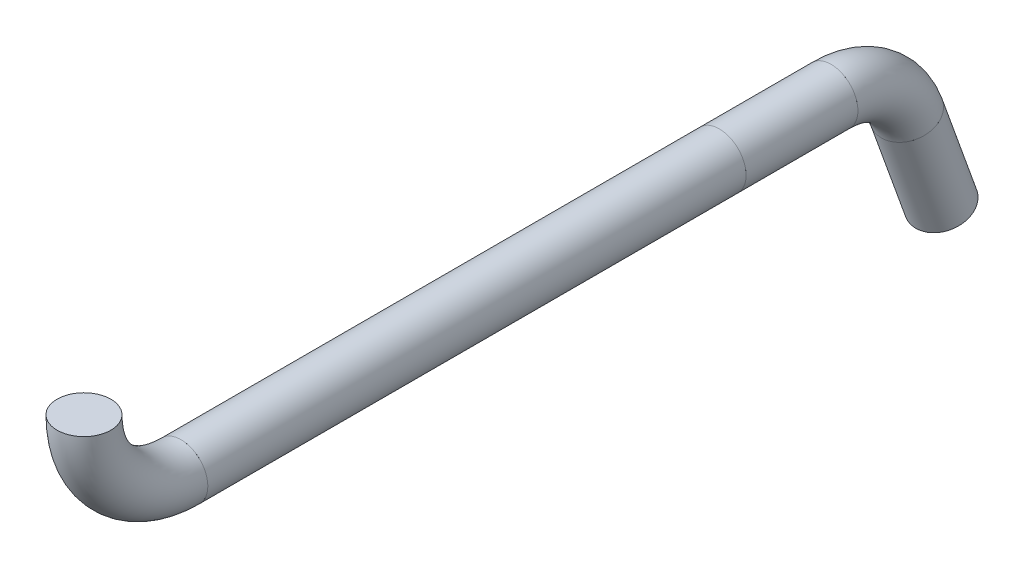
ISO-10303-21;
HEADER;
FILE_DESCRIPTION(('STEP AP214'),'2;1');
FILE_NAME('part.step','',(''),(''),'','','');
FILE_SCHEMA(('AUTOMOTIVE_DESIGN { 1 0 10303 214 1 1 1 1 }'));
ENDSEC;
DATA;
#1=APPLICATION_CONTEXT('core data for automotive mechanical design processes');
#2=APPLICATION_PROTOCOL_DEFINITION('international standard','automotive_design',2000,#1);
#3=PRODUCT_CONTEXT('',#1,'mechanical');
#4=PRODUCT('Part','Part','',(#3));
#5=PRODUCT_RELATED_PRODUCT_CATEGORY('part','',(#4));
#6=PRODUCT_DEFINITION_FORMATION('','',#4);
#7=PRODUCT_DEFINITION_CONTEXT('part definition',#1,'design');
#8=PRODUCT_DEFINITION('design','',#6,#7);
#9=PRODUCT_DEFINITION_SHAPE('','',#8);
#10=(LENGTH_UNIT() NAMED_UNIT(*) SI_UNIT(.MILLI.,.METRE.));
#11=(NAMED_UNIT(*) PLANE_ANGLE_UNIT() SI_UNIT($,.RADIAN.));
#12=(NAMED_UNIT(*) SI_UNIT($,.STERADIAN.) SOLID_ANGLE_UNIT());
#13=UNCERTAINTY_MEASURE_WITH_UNIT(LENGTH_MEASURE(1.E-05),#10,'distance_accuracy_value','');
#14=(GEOMETRIC_REPRESENTATION_CONTEXT(3) GLOBAL_UNCERTAINTY_ASSIGNED_CONTEXT((#13)) GLOBAL_UNIT_ASSIGNED_CONTEXT((#10,
#11,#12)) REPRESENTATION_CONTEXT('',''));
#15=CARTESIAN_POINT('',(0.,0.,0.));
#16=DIRECTION('',(0.,0.,1.));
#17=DIRECTION('',(1.,0.,0.));
#18=AXIS2_PLACEMENT_3D('',#15,#16,#17);
#19=CARTESIAN_POINT('',(-1.04762439148012,-187.845617875005,-220.220231443653));
#20=DIRECTION('',(-0.0052307758193522,-0.939678304412021,-0.342019477810368));
#21=DIRECTION('',(0.,0.342024156906533,-0.939691159952234));
#22=AXIS2_PLACEMENT_3D('',#19,#20,#21);
#23=CYLINDRICAL_SURFACE('',#22,49.9);
#24=CARTESIAN_POINT('',(-1.54388367359085,-276.99569749365,-252.668638025735));
#25=DIRECTION('',(0.00523077581934009,0.939678304411721,0.342019477811193));
#26=DIRECTION('',(0.,-0.342024156907358,0.939691159951934));
#27=AXIS2_PLACEMENT_3D('',#24,#25,#26);
#28=CIRCLE('',#27,49.9);
#29=CARTESIAN_POINT('',(-1.54388367359085,-294.062702923328,-205.778049144133));
#30=VERTEX_POINT('',#29);
#31=EDGE_CURVE('E60',#30,#30,#28,.F.);
#32=ORIENTED_EDGE('',*,*,#31,.F.);
#33=EDGE_LOOP('',(#32));
#34=FACE_BOUND('',#33,.T.);
#35=CARTESIAN_POINT('',(-0.551365109369398,-98.6955382563591,-187.771824861572));
#36=DIRECTION('',(-0.00523077581933964,-0.939678304411721,-0.342019477811193));
#37=DIRECTION('',(0.,0.342024156907358,-0.939691159951934));
#38=AXIS2_PLACEMENT_3D('',#35,#36,#37);
#39=CIRCLE('',#38,49.9);
#40=CARTESIAN_POINT('',(-0.551365109369398,-81.6285328266819,-234.662413743174));
#41=VERTEX_POINT('',#40);
#42=EDGE_CURVE('E12',#41,#41,#39,.T.);
#43=ORIENTED_EDGE('',*,*,#42,.T.);
#44=EDGE_LOOP('',(#43));
#45=FACE_BOUND('',#44,.T.);
#46=ADVANCED_FACE('F57',(#34,#45),#23,.T.);
#47=CARTESIAN_POINT('',(-1.81357545905958,-325.798231686941,-118.582434595143));
#48=DIRECTION('',(0.00523077581934009,0.939678304411721,0.342019477811193));
#49=DIRECTION('',(0.,-0.342024156907358,0.939691159951934));
#50=AXIS2_PLACEMENT_3D('',#47,#48,#49);
#51=PLANE('',#50);
#52=ORIENTED_EDGE('',*,*,#31,.T.);
#53=EDGE_LOOP('',(#52));
#54=FACE_BOUND('',#53,.T.);
#55=ADVANCED_FACE('F76',(#54),#51,.F.);
#56=CARTESIAN_POINT('',(-0.821056894840349,-147.498072449707,-53.6856214308239));
#57=DIRECTION('',(-0.00523077581933964,-0.939678304411721,-0.342019477811193));
#58=DIRECTION('',(0.,0.342024156907358,-0.939691159951934));
#59=AXIS2_PLACEMENT_3D('',#56,#57,#58);
#60=PLANE('',#59);
#61=ORIENTED_EDGE('',*,*,#42,.F.);
#62=EDGE_LOOP('',(#61));
#63=FACE_BOUND('',#62,.T.);
#64=ADVANCED_FACE('F82',(#63),#60,.F.);
#65=CLOSED_SHELL('',(#46,#55,#64));
#66=MANIFOLD_SOLID_BREP('B2',#65);
#67=CARTESIAN_POINT('',(-0.835935154537799,-149.997670695678,-46.8178954127342));
#68=DIRECTION('',(0.999984519814332,-0.00556417936035084,-6.3043754299794E-06));
#69=DIRECTION('',(0.00189713363445594,0.342014216262124,-0.939692862992254));
#70=AXIS2_PLACEMENT_3D('',#67,#68,#69);
#71=TOROIDAL_SURFACE('',#70,150.,49.9);
#72=CARTESIAN_POINT('',(-0.00130825046858879,7.27945312362088E-06,-46.8178954127342));
#73=DIRECTION('',(-6.30427783720135E-06,3.50786758669803E-08,-0.999999999980128));
#74=DIRECTION('',(-0.999999999980128,0.,6.30427783720136E-06));
#75=AXIS2_PLACEMENT_3D('',#72,#73,#74);
#76=CIRCLE('',#75,49.9);
#77=CARTESIAN_POINT('',(-49.901308249477,7.27945312362088E-06,-46.8175808292701));
#78=VERTEX_POINT('',#77);
#79=EDGE_CURVE('E126',#78,#78,#76,.T.);
#80=ORIENTED_EDGE('',*,*,#79,.T.);
#81=EDGE_LOOP('',(#80));
#82=FACE_BOUND('',#81,.T.);
#83=CARTESIAN_POINT('',(-0.551365109369532,-98.6955382563816,-187.771824861581));
#84=DIRECTION('',(0.00523077714160003,0.939678331703412,0.342019402808652));
#85=DIRECTION('',(0.,-0.342024081906156,0.939691187250498));
#86=AXIS2_PLACEMENT_3D('',#83,#84,#85);
#87=CIRCLE('',#86,49.9);
#88=CARTESIAN_POINT('',(-0.551365109369532,-115.762539943499,-140.881234617781));
#89=VERTEX_POINT('',#88);
#90=EDGE_CURVE('E56',#89,#89,#87,.F.);
#91=ORIENTED_EDGE('',*,*,#90,.F.);
#92=EDGE_LOOP('',(#91));
#93=FACE_BOUND('',#92,.T.);
#94=ADVANCED_FACE('F123',(#82,#93),#71,.T.);
#95=CARTESIAN_POINT('',(-0.000295153020481042,1.64230977821417E-06,-46.8178954191212));
#96=DIRECTION('',(-6.30427783720135E-06,3.50786758669803E-08,-0.999999999980128));
#97=DIRECTION('',(-0.999999999980128,0.,6.30427783720136E-06));
#98=AXIS2_PLACEMENT_3D('',#95,#96,#97);
#99=PLANE('',#98);
#100=ORIENTED_EDGE('',*,*,#79,.F.);
#101=EDGE_LOOP('',(#100));
#102=FACE_BOUND('',#101,.T.);
#103=ADVANCED_FACE('F144',(#102),#99,.F.);
#104=CARTESIAN_POINT('',(-0.82105704281747,-147.498066031553,-53.6856057626593));
#105=DIRECTION('',(0.00523077714160003,0.939678331703412,0.342019402808652));
#106=DIRECTION('',(0.,-0.342024081906156,0.939691187250498));
#107=AXIS2_PLACEMENT_3D('',#104,#105,#106);
#108=PLANE('',#107);
#109=ORIENTED_EDGE('',*,*,#90,.T.);
#110=EDGE_LOOP('',(#109));
#111=FACE_BOUND('',#110,.T.);
#112=ADVANCED_FACE('F146',(#111),#108,.F.);
#113=CLOSED_SHELL('',(#94,#103,#112));
#114=MANIFOLD_SOLID_BREP('B7',#113);
#115=CARTESIAN_POINT('',(-0.000654125234053938,3.63972665547261E-06,56.9410522935832));
#116=DIRECTION('',(-6.30427783720271E-06,3.50786759791123E-08,-0.999999999980128));
#117=DIRECTION('',(-0.999999999980128,0.,6.30427783720272E-06));
#118=AXIS2_PLACEMENT_3D('',#115,#116,#117);
#119=CYLINDRICAL_SURFACE('',#118,49.9);
#120=CARTESIAN_POINT('',(-0.00130825046850335,7.27945316206851E-06,-46.8178954127342));
#121=DIRECTION('',(6.30427783756629E-06,-3.50786758061578E-08,0.999999999980127));
#122=DIRECTION('',(0.999999999980128,0.,-6.30427783756629E-06));
#123=AXIS2_PLACEMENT_3D('',#120,#121,#122);
#124=CIRCLE('',#123,49.9);
#125=CARTESIAN_POINT('',(49.8986917485399,7.27945316206851E-06,-46.8182099961983));
#126=VERTEX_POINT('',#125);
#127=EDGE_CURVE('E122',#126,#126,#124,.F.);
#128=ORIENTED_EDGE('',*,*,#127,.F.);
#129=EDGE_LOOP('',(#128));
#130=FACE_BOUND('',#129,.T.);
#131=CARTESIAN_POINT('',(3.95473678091618E-13,1.48876715667246E-13,160.699999999901));
#132=DIRECTION('',(-6.30427783799205E-06,3.5078675684512E-08,-0.999999999980127));
#133=DIRECTION('',(-0.999999999980128,0.,6.30427783799205E-06));
#134=AXIS2_PLACEMENT_3D('',#131,#132,#133);
#135=CIRCLE('',#134,49.9);
#136=CARTESIAN_POINT('',(-49.899999999008,1.48876715667246E-13,160.700314583365));
#137=VERTEX_POINT('',#136);
#138=EDGE_CURVE('E192',#137,#137,#135,.F.);
#139=ORIENTED_EDGE('',*,*,#138,.F.);
#140=EDGE_LOOP('',(#139));
#141=FACE_BOUND('',#140,.T.);
#142=ADVANCED_FACE('F189',(#130,#141),#119,.T.);
#143=CARTESIAN_POINT('',(0.00101309744854456,-5.63714318238557E-06,160.699999993514));
#144=DIRECTION('',(-6.30427783799205E-06,3.5078675684512E-08,-0.999999999980127));
#145=DIRECTION('',(-0.999999999980128,0.,6.30427783799205E-06));
#146=AXIS2_PLACEMENT_3D('',#143,#144,#145);
#147=PLANE('',#146);
#148=ORIENTED_EDGE('',*,*,#138,.T.);
#149=EDGE_LOOP('',(#148));
#150=FACE_BOUND('',#149,.T.);
#151=ADVANCED_FACE('F208',(#150),#147,.F.);
#152=CARTESIAN_POINT('',(-0.000295153020498128,1.64230977536659E-06,-46.8178954191213));
#153=DIRECTION('',(6.30427783756629E-06,-3.50786758061578E-08,0.999999999980127));
#154=DIRECTION('',(0.999999999980128,0.,-6.30427783756629E-06));
#155=AXIS2_PLACEMENT_3D('',#152,#153,#154);
#156=PLANE('',#155);
#157=ORIENTED_EDGE('',*,*,#127,.T.);
#158=EDGE_LOOP('',(#157));
#159=FACE_BOUND('',#158,.T.);
#160=ADVANCED_FACE('F215',(#159),#156,.F.);
#161=CLOSED_SHELL('',(#142,#151,#160));
#162=MANIFOLD_SOLID_BREP('B51',#161);
#163=CARTESIAN_POINT('',(0.,0.,1115.));
#164=DIRECTION('',(0.,0.,-1.));
#165=DIRECTION('',(0.,1.,0.));
#166=AXIS2_PLACEMENT_3D('',#163,#164,#165);
#167=CYLINDRICAL_SURFACE('',#166,49.9);
#168=CARTESIAN_POINT('',(0.,0.,1160.));
#169=DIRECTION('',(0.,0.,-1.));
#170=DIRECTION('',(-1.,0.,0.));
#171=AXIS2_PLACEMENT_3D('',#168,#169,#170);
#172=CIRCLE('',#171,49.9);
#173=CARTESIAN_POINT('',(-49.9,0.,1160.));
#174=VERTEX_POINT('',#173);
#175=EDGE_CURVE('E264',#174,#174,#172,.T.);
#176=ORIENTED_EDGE('',*,*,#175,.T.);
#177=EDGE_LOOP('',(#176));
#178=FACE_BOUND('',#177,.T.);
#179=CARTESIAN_POINT('',(0.,0.,160.699997300043));
#180=DIRECTION('',(6.12077133986407E-06,2.45273485305518E-08,0.999999999981268));
#181=DIRECTION('',(0.999991971125247,0.00400719946835947,-6.12082048305023E-06));
#182=AXIS2_PLACEMENT_3D('',#179,#180,#181);
#183=ELLIPSE('',#182,49.9000000009347,49.9);
#184=CARTESIAN_POINT('',(49.8995993600845,0.199959253474936,160.699691871101));
#185=VERTEX_POINT('',#184);
#186=EDGE_CURVE('E188',#185,#185,#183,.T.);
#187=ORIENTED_EDGE('',*,*,#186,.T.);
#188=EDGE_LOOP('',(#187));
#189=FACE_BOUND('',#188,.T.);
#190=ADVANCED_FACE('F257',(#178,#189),#167,.T.);
#191=CARTESIAN_POINT('',(4.5154928287915E-12,0.,1160.));
#192=DIRECTION('',(0.,0.,-1.));
#193=DIRECTION('',(-1.,0.,0.));
#194=AXIS2_PLACEMENT_3D('',#191,#192,#193);
#195=PLANE('',#194);
#196=ORIENTED_EDGE('',*,*,#175,.F.);
#197=EDGE_LOOP('',(#196));
#198=FACE_BOUND('',#197,.T.);
#199=ADVANCED_FACE('F277',(#198),#195,.F.);
#200=CARTESIAN_POINT('',(0.00098360793777191,3.94154484256305E-06,160.699997294022));
#201=DIRECTION('',(6.12077133986407E-06,2.45273485305518E-08,0.999999999981268));
#202=DIRECTION('',(0.999999999981268,0.,-6.12077133986407E-06));
#203=AXIS2_PLACEMENT_3D('',#200,#201,#202);
#204=PLANE('',#203);
#205=ORIENTED_EDGE('',*,*,#186,.F.);
#206=EDGE_LOOP('',(#205));
#207=FACE_BOUND('',#206,.T.);
#208=ADVANCED_FACE('F279',(#207),#204,.F.);
#209=CLOSED_SHELL('',(#190,#199,#208));
#210=MANIFOLD_SOLID_BREP('B117',#209);
#211=CARTESIAN_POINT('',(0.,180.,1160.));
#212=DIRECTION('',(1.,0.,0.));
#213=DIRECTION('',(0.,0.,1.));
#214=AXIS2_PLACEMENT_3D('',#211,#212,#213);
#215=TOROIDAL_SURFACE('',#214,180.,49.9);
#216=CARTESIAN_POINT('',(0.,180.,1340.));
#217=DIRECTION('',(0.,-1.,0.));
#218=DIRECTION('',(0.,0.,-1.));
#219=AXIS2_PLACEMENT_3D('',#216,#217,#218);
#220=CIRCLE('',#219,49.9);
#221=CARTESIAN_POINT('',(0.,180.,1389.9));
#222=VERTEX_POINT('',#221);
#223=EDGE_CURVE('E327',#222,#222,#220,.T.);
#224=CARTESIAN_POINT('',(0.,0.,1160.));
#225=DIRECTION('',(0.,0.,1.));
#226=DIRECTION('',(0.,-1.,0.));
#227=AXIS2_PLACEMENT_3D('',#224,#225,#226);
#228=CIRCLE('',#227,49.9);
#229=CARTESIAN_POINT('',(0.,-49.9,1160.));
#230=VERTEX_POINT('',#229);
#231=EDGE_CURVE('E256',#230,#230,#228,.F.);
#232=CARTESIAN_POINT('',(0.,180.,1160.));
#233=DIRECTION('',(1.,0.,0.));
#234=DIRECTION('',(0.,0.,1.));
#235=AXIS2_PLACEMENT_3D('',#232,#233,#234);
#236=CIRCLE('',#235,229.9);
#237=EDGE_CURVE('',#222,#230,#236,.T.);
#238=ORIENTED_EDGE('',*,*,#223,.T.);
#239=ORIENTED_EDGE('',*,*,#231,.F.);
#240=ORIENTED_EDGE('',*,*,#237,.T.);
#241=ORIENTED_EDGE('',*,*,#237,.F.);
#242=EDGE_LOOP('',(#238,#240,#239,#241));
#243=FACE_BOUND('',#242,.T.);
#244=ADVANCED_FACE('F324',(#243),#215,.T.);
#245=CARTESIAN_POINT('',(0.,180.,0.));
#246=DIRECTION('',(0.,-1.,0.));
#247=DIRECTION('',(0.,0.,-1.));
#248=AXIS2_PLACEMENT_3D('',#245,#246,#247);
#249=PLANE('',#248);
#250=ORIENTED_EDGE('',*,*,#223,.F.);
#251=EDGE_LOOP('',(#250));
#252=FACE_BOUND('',#251,.T.);
#253=ADVANCED_FACE('F344',(#252),#249,.F.);
#254=CARTESIAN_POINT('',(0.,4.5154928287915E-12,1160.));
#255=DIRECTION('',(0.,0.,1.));
#256=DIRECTION('',(0.,-1.,0.));
#257=AXIS2_PLACEMENT_3D('',#254,#255,#256);
#258=PLANE('',#257);
#259=ORIENTED_EDGE('',*,*,#231,.T.);
#260=EDGE_LOOP('',(#259));
#261=FACE_BOUND('',#260,.T.);
#262=ADVANCED_FACE('F346',(#261),#258,.F.);
#263=CLOSED_SHELL('',(#244,#253,#262));
#264=MANIFOLD_SOLID_BREP('B183',#263);
#265=ADVANCED_BREP_SHAPE_REPRESENTATION('',(#18,#66,#114,#162,#210,#264),#14);
#266=SHAPE_DEFINITION_REPRESENTATION(#9,#265);
ENDSEC;
END-ISO-10303-21;
